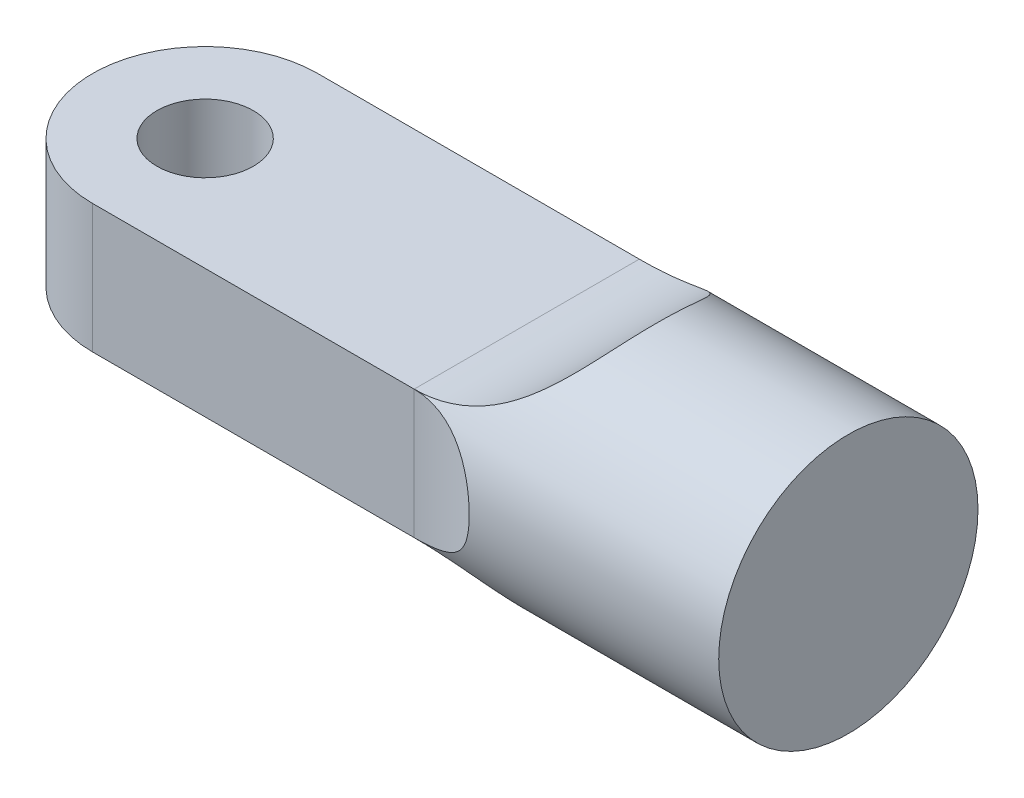
ISO-10303-21;
HEADER;
FILE_DESCRIPTION(('STEP AP214'),'2;1');
FILE_NAME('part.step','',(''),(''),'','','');
FILE_SCHEMA(('AUTOMOTIVE_DESIGN { 1 0 10303 214 1 1 1 1 }'));
ENDSEC;
DATA;
#1=APPLICATION_CONTEXT('core data for automotive mechanical design processes');
#2=APPLICATION_PROTOCOL_DEFINITION('international standard','automotive_design',2000,#1);
#3=PRODUCT_CONTEXT('',#1,'mechanical');
#4=PRODUCT('Part','Part','',(#3));
#5=PRODUCT_RELATED_PRODUCT_CATEGORY('part','',(#4));
#6=PRODUCT_DEFINITION_FORMATION('','',#4);
#7=PRODUCT_DEFINITION_CONTEXT('part definition',#1,'design');
#8=PRODUCT_DEFINITION('design','',#6,#7);
#9=PRODUCT_DEFINITION_SHAPE('','',#8);
#10=(LENGTH_UNIT() NAMED_UNIT(*) SI_UNIT(.MILLI.,.METRE.));
#11=(NAMED_UNIT(*) PLANE_ANGLE_UNIT() SI_UNIT($,.RADIAN.));
#12=(NAMED_UNIT(*) SI_UNIT($,.STERADIAN.) SOLID_ANGLE_UNIT());
#13=UNCERTAINTY_MEASURE_WITH_UNIT(LENGTH_MEASURE(1.E-05),#10,'distance_accuracy_value','');
#14=(GEOMETRIC_REPRESENTATION_CONTEXT(3) GLOBAL_UNCERTAINTY_ASSIGNED_CONTEXT((#13)) GLOBAL_UNIT_ASSIGNED_CONTEXT((#10,
#11,#12)) REPRESENTATION_CONTEXT('',''));
#15=CARTESIAN_POINT('',(0.,0.,0.));
#16=DIRECTION('',(0.,0.,1.));
#17=DIRECTION('',(1.,0.,0.));
#18=AXIS2_PLACEMENT_3D('',#15,#16,#17);
#19=CARTESIAN_POINT('',(0.,20.,-35.));
#20=DIRECTION('',(0.,0.,-1.));
#21=DIRECTION('',(-1.,0.,0.));
#22=AXIS2_PLACEMENT_3D('',#19,#20,#21);
#23=PLANE('',#22);
#24=DIRECTION('',(1.,0.,0.));
#25=VECTOR('',#24,1.);
#26=CARTESIAN_POINT('',(0.,20.,-35.));
#27=LINE('',#26,#25);
#28=CARTESIAN_POINT('',(0.,20.,-35.));
#29=VERTEX_POINT('',#28);
#30=CARTESIAN_POINT('',(99.9999999999998,20.,-34.9999999999997));
#31=VERTEX_POINT('',#30);
#32=EDGE_CURVE('E86',#29,#31,#27,.T.);
#33=ORIENTED_EDGE('',*,*,#32,.T.);
#34=DIRECTION('',(0.,-1.,0.));
#35=VECTOR('',#34,1.);
#36=CARTESIAN_POINT('',(99.9999999999995,20.,-35.));
#37=LINE('',#36,#35);
#38=CARTESIAN_POINT('',(99.9999999999998,-20.,-34.9999999999954));
#39=VERTEX_POINT('',#38);
#40=EDGE_CURVE('E93',#31,#39,#37,.T.);
#41=ORIENTED_EDGE('',*,*,#40,.T.);
#42=DIRECTION('',(1.,0.,0.));
#43=VECTOR('',#42,1.);
#44=CARTESIAN_POINT('',(0.,-20.,-35.));
#45=LINE('',#44,#43);
#46=CARTESIAN_POINT('',(0.,-20.,-35.));
#47=VERTEX_POINT('',#46);
#48=EDGE_CURVE('E89',#47,#39,#45,.T.);
#49=ORIENTED_EDGE('',*,*,#48,.F.);
#50=DIRECTION('',(0.,-1.,0.));
#51=VECTOR('',#50,1.);
#52=CARTESIAN_POINT('',(0.,20.,-35.));
#53=LINE('',#52,#51);
#54=EDGE_CURVE('E82',#29,#47,#53,.T.);
#55=ORIENTED_EDGE('',*,*,#54,.F.);
#56=EDGE_LOOP('',(#33,#41,#49,#55));
#57=FACE_BOUND('',#56,.T.);
#58=ADVANCED_FACE('F41',(#57),#23,.T.);
#59=CARTESIAN_POINT('',(0.,20.,35.));
#60=DIRECTION('',(0.,0.,-1.));
#61=DIRECTION('',(-1.,0.,0.));
#62=AXIS2_PLACEMENT_3D('',#59,#60,#61);
#63=PLANE('',#62);
#64=DIRECTION('',(1.,0.,0.));
#65=VECTOR('',#64,1.);
#66=CARTESIAN_POINT('',(0.,-20.,35.));
#67=LINE('',#66,#65);
#68=CARTESIAN_POINT('',(0.,-20.,35.));
#69=VERTEX_POINT('',#68);
#70=CARTESIAN_POINT('',(100.,-20.,35.0000000000003));
#71=VERTEX_POINT('',#70);
#72=EDGE_CURVE('E112',#69,#71,#67,.T.);
#73=ORIENTED_EDGE('',*,*,#72,.T.);
#74=DIRECTION('',(0.,-1.,0.));
#75=VECTOR('',#74,1.);
#76=CARTESIAN_POINT('',(100.000000000001,20.,35.));
#77=LINE('',#76,#75);
#78=CARTESIAN_POINT('',(100.,20.,34.9999999999942));
#79=VERTEX_POINT('',#78);
#80=EDGE_CURVE('E128',#71,#79,#77,.F.);
#81=ORIENTED_EDGE('',*,*,#80,.T.);
#82=DIRECTION('',(1.,0.,0.));
#83=VECTOR('',#82,1.);
#84=CARTESIAN_POINT('',(0.,20.,35.));
#85=LINE('',#84,#83);
#86=CARTESIAN_POINT('',(0.,20.,35.));
#87=VERTEX_POINT('',#86);
#88=EDGE_CURVE('E103',#87,#79,#85,.T.);
#89=ORIENTED_EDGE('',*,*,#88,.F.);
#90=DIRECTION('',(0.,-1.,0.));
#91=VECTOR('',#90,1.);
#92=CARTESIAN_POINT('',(0.,20.,35.));
#93=LINE('',#92,#91);
#94=EDGE_CURVE('E94',#87,#69,#93,.T.);
#95=ORIENTED_EDGE('',*,*,#94,.T.);
#96=EDGE_LOOP('',(#73,#81,#89,#95));
#97=FACE_BOUND('',#96,.T.);
#98=ADVANCED_FACE('F177',(#97),#63,.F.);
#99=CARTESIAN_POINT('',(0.,20.,0.));
#100=DIRECTION('',(0.,1.,0.));
#101=DIRECTION('',(0.,0.,1.));
#102=AXIS2_PLACEMENT_3D('',#99,#100,#101);
#103=PLANE('',#102);
#104=CARTESIAN_POINT('',(0.,20.,0.));
#105=DIRECTION('',(0.,1.,0.));
#106=DIRECTION('',(0.,0.,1.));
#107=AXIS2_PLACEMENT_3D('',#104,#105,#106);
#108=CIRCLE('',#107,15.);
#109=CARTESIAN_POINT('',(0.,20.,15.));
#110=VERTEX_POINT('',#109);
#111=EDGE_CURVE('E109',#110,#110,#108,.T.);
#112=ORIENTED_EDGE('',*,*,#111,.F.);
#113=EDGE_LOOP('',(#112));
#114=FACE_BOUND('',#113,.T.);
#115=ORIENTED_EDGE('',*,*,#88,.T.);
#116=DIRECTION('',(0.,0.,-1.));
#117=VECTOR('',#116,1.);
#118=CARTESIAN_POINT('',(100.,20.,-6.34413156928661E-13));
#119=LINE('',#118,#117);
#120=EDGE_CURVE('E108',#79,#31,#119,.T.);
#121=ORIENTED_EDGE('',*,*,#120,.T.);
#122=ORIENTED_EDGE('',*,*,#32,.F.);
#123=CARTESIAN_POINT('',(0.,20.,0.));
#124=DIRECTION('',(0.,1.,0.));
#125=DIRECTION('',(0.,0.,1.));
#126=AXIS2_PLACEMENT_3D('',#123,#124,#125);
#127=CIRCLE('',#126,35.);
#128=EDGE_CURVE('E98',#29,#87,#127,.T.);
#129=ORIENTED_EDGE('',*,*,#128,.T.);
#130=EDGE_LOOP('',(#115,#121,#122,#129));
#131=FACE_BOUND('',#130,.T.);
#132=ADVANCED_FACE('F106',(#114,#131),#103,.T.);
#133=CARTESIAN_POINT('',(0.,-20.,0.));
#134=DIRECTION('',(0.,1.,0.));
#135=DIRECTION('',(0.,0.,1.));
#136=AXIS2_PLACEMENT_3D('',#133,#134,#135);
#137=PLANE('',#136);
#138=CARTESIAN_POINT('',(0.,-20.,0.));
#139=DIRECTION('',(0.,1.,0.));
#140=DIRECTION('',(0.,0.,1.));
#141=AXIS2_PLACEMENT_3D('',#138,#139,#140);
#142=CIRCLE('',#141,15.);
#143=CARTESIAN_POINT('',(0.,-20.,15.));
#144=VERTEX_POINT('',#143);
#145=EDGE_CURVE('E117',#144,#144,#142,.T.);
#146=ORIENTED_EDGE('',*,*,#145,.T.);
#147=EDGE_LOOP('',(#146));
#148=FACE_BOUND('',#147,.T.);
#149=ORIENTED_EDGE('',*,*,#48,.T.);
#150=DIRECTION('',(0.,0.,-1.));
#151=VECTOR('',#150,1.);
#152=CARTESIAN_POINT('',(100.,-20.,35.0000000000003));
#153=LINE('',#152,#151);
#154=EDGE_CURVE('E198',#39,#71,#153,.F.);
#155=ORIENTED_EDGE('',*,*,#154,.T.);
#156=ORIENTED_EDGE('',*,*,#72,.F.);
#157=CARTESIAN_POINT('',(0.,-20.,0.));
#158=DIRECTION('',(0.,1.,0.));
#159=DIRECTION('',(0.,0.,1.));
#160=AXIS2_PLACEMENT_3D('',#157,#158,#159);
#161=CIRCLE('',#160,35.);
#162=EDGE_CURVE('E122',#47,#69,#161,.T.);
#163=ORIENTED_EDGE('',*,*,#162,.F.);
#164=EDGE_LOOP('',(#149,#155,#156,#163));
#165=FACE_BOUND('',#164,.T.);
#166=ADVANCED_FACE('F191',(#148,#165),#137,.F.);
#167=CARTESIAN_POINT('',(0.,20.,0.));
#168=DIRECTION('',(0.,-1.,0.));
#169=DIRECTION('',(0.,0.,-1.));
#170=AXIS2_PLACEMENT_3D('',#167,#168,#169);
#171=CYLINDRICAL_SURFACE('',#170,35.);
#172=ORIENTED_EDGE('',*,*,#162,.T.);
#173=ORIENTED_EDGE('',*,*,#94,.F.);
#174=ORIENTED_EDGE('',*,*,#128,.F.);
#175=ORIENTED_EDGE('',*,*,#54,.T.);
#176=EDGE_LOOP('',(#172,#173,#174,#175));
#177=FACE_BOUND('',#176,.T.);
#178=ADVANCED_FACE('F99',(#177),#171,.T.);
#179=CARTESIAN_POINT('',(0.,20.,0.));
#180=DIRECTION('',(0.,-1.,0.));
#181=DIRECTION('',(0.,0.,-1.));
#182=AXIS2_PLACEMENT_3D('',#179,#180,#181);
#183=CYLINDRICAL_SURFACE('',#182,15.);
#184=ORIENTED_EDGE('',*,*,#111,.T.);
#185=EDGE_LOOP('',(#184));
#186=FACE_BOUND('',#185,.T.);
#187=ORIENTED_EDGE('',*,*,#145,.F.);
#188=EDGE_LOOP('',(#187));
#189=FACE_BOUND('',#188,.T.);
#190=ADVANCED_FACE('F153',(#186,#189),#183,.F.);
#191=CARTESIAN_POINT('',(150.,0.,-9.51619735392991E-13));
#192=DIRECTION('',(1.,0.,0.));
#193=DIRECTION('',(0.,0.,-1.));
#194=AXIS2_PLACEMENT_3D('',#191,#192,#193);
#195=CYLINDRICAL_SURFACE('',#194,40.3112887414882);
#196=CARTESIAN_POINT('',(200.,0.,-1.26882631385732E-12));
#197=DIRECTION('',(1.,0.,0.));
#198=DIRECTION('',(0.,0.,-1.));
#199=AXIS2_PLACEMENT_3D('',#196,#197,#198);
#200=CIRCLE('',#199,40.3112887414882);
#201=CARTESIAN_POINT('',(200.,0.,-40.3112887414895));
#202=VERTEX_POINT('',#201);
#203=EDGE_CURVE('E120',#202,#202,#200,.T.);
#204=ORIENTED_EDGE('',*,*,#203,.F.);
#205=EDGE_LOOP('',(#204));
#206=FACE_BOUND('',#205,.T.);
#207=CARTESIAN_POINT('',(99.9999999999998,-20.,-34.9999999999954));
#208=CARTESIAN_POINT('',(100.316458247621,-19.9999956612868,-34.9999975109647));
#209=CARTESIAN_POINT('',(100.63288489274,-19.9947421830849,-35.0030051247058));
#210=CARTESIAN_POINT('',(101.265277746762,-19.9737120426064,-35.0150116053396));
#211=CARTESIAN_POINT('',(101.581243950679,-19.9579352672348,-35.0240105366217));
#212=CARTESIAN_POINT('',(102.527841053449,-19.8947831247184,-35.0599505983783));
#213=CARTESIAN_POINT('',(103.157175248306,-19.8315859418579,-35.095834997604));
#214=CARTESIAN_POINT('',(104.409971580463,-19.662426904606,-35.1908845807871));
#215=CARTESIAN_POINT('',(105.033413392485,-19.5563505827652,-35.2501120693238));
#216=CARTESIAN_POINT('',(106.268833238843,-19.3008686580088,-35.3906446712033));
#217=CARTESIAN_POINT('',(106.880811838077,-19.1514651962277,-35.4719486935583));
#218=CARTESIAN_POINT('',(108.090224785705,-18.8083607402516,-35.6550617520617));
#219=CARTESIAN_POINT('',(108.687633453693,-18.6145870188244,-35.756904420023));
#220=CARTESIAN_POINT('',(109.86256867059,-18.1821792663509,-35.9787073147059));
#221=CARTESIAN_POINT('',(110.440095012201,-17.9435447677392,-36.0986677302588));
#222=CARTESIAN_POINT('',(111.570251375929,-17.4210907988164,-36.3536790321481));
#223=CARTESIAN_POINT('',(112.122903580851,-17.1373126547778,-36.4887160833487));
#224=CARTESIAN_POINT('',(113.199230076074,-16.5241644263273,-36.770446898039));
#225=CARTESIAN_POINT('',(113.722904812897,-16.1947950447158,-36.9171404818255));
#226=CARTESIAN_POINT('',(114.738276269914,-15.4895195376077,-37.2185743297325));
#227=CARTESIAN_POINT('',(115.229859993763,-15.1134612190491,-37.37333990258));
#228=CARTESIAN_POINT('',(116.174421968679,-14.3166051192472,-37.6857781000687));
#229=CARTESIAN_POINT('',(116.62739916474,-13.8958061160755,-37.8434508040102));
#230=CARTESIAN_POINT('',(117.49017183271,-13.0113120083582,-38.1565952107827));
#231=CARTESIAN_POINT('',(117.899970664683,-12.5476202469335,-38.3120670840622));
#232=CARTESIAN_POINT('',(118.672215269828,-11.5801088754669,-38.6155137143806));
#233=CARTESIAN_POINT('',(119.03466791584,-11.0762951067226,-38.7634895576406));
#234=CARTESIAN_POINT('',(119.671733059988,-10.0894100796121,-39.0312172283771));
#235=CARTESIAN_POINT('',(119.951616476186,-9.61009074945936,-39.1522861360015));
#236=CARTESIAN_POINT('',(120.468783752208,-8.62586315410757,-39.3808278047358));
#237=CARTESIAN_POINT('',(120.706068100275,-8.12095518227369,-39.4883007216698));
#238=CARTESIAN_POINT('',(121.135952269211,-7.09008625849753,-39.6863430645485));
#239=CARTESIAN_POINT('',(121.328610556354,-6.56415392347483,-39.7769345766633));
#240=CARTESIAN_POINT('',(121.668240664662,-5.49492001083491,-39.9386770435708));
#241=CARTESIAN_POINT('',(121.815225333977,-4.95162336537334,-40.0098334648408));
#242=CARTESIAN_POINT('',(122.0197688824,-4.04250701444694,-40.1097143293616));
#243=CARTESIAN_POINT('',(122.09067418746,-3.68029702069758,-40.1446025167955));
#244=CARTESIAN_POINT('',(122.212360585053,-2.95173169753072,-40.2047359689521));
#245=CARTESIAN_POINT('',(122.263143794574,-2.58537680835955,-40.229982248063));
#246=CARTESIAN_POINT('',(122.344450983402,-1.84985573874784,-40.270506646434));
#247=CARTESIAN_POINT('',(122.374973692046,-1.48068938345112,-40.2857841404886));
#248=CARTESIAN_POINT('',(122.415676358058,-0.741028359304655,-40.3061755717437));
#249=CARTESIAN_POINT('',(122.425859189078,-0.370533885504404,-40.3112909446655));
#250=CARTESIAN_POINT('',(122.425855224418,0.5160844243466,-40.311285672876));
#251=CARTESIAN_POINT('',(122.40609574194,1.03224530456673,-40.3013548743775));
#252=CARTESIAN_POINT('',(122.327144584878,2.06084647471009,-40.2618674004094));
#253=CARTESIAN_POINT('',(122.267945106583,2.57328600802829,-40.2323068409424));
#254=CARTESIAN_POINT('',(122.110352844016,3.59106435646676,-40.1542640816854));
#255=CARTESIAN_POINT('',(122.011929262887,4.09639726828023,-40.1057670144772));
#256=CARTESIAN_POINT('',(121.776422881152,5.09588417800759,-39.9910616481421));
#257=CARTESIAN_POINT('',(121.639342040463,5.59003874129015,-39.9248542469348));
#258=CARTESIAN_POINT('',(121.327511362983,6.56305700736616,-39.7764773865862));
#259=CARTESIAN_POINT('',(121.152815023897,7.04194132869968,-39.6943306130533));
#260=CARTESIAN_POINT('',(120.76666906226,7.98194734052419,-39.5160397260343));
#261=CARTESIAN_POINT('',(120.555219183097,8.4430689069682,-39.419895514819));
#262=CARTESIAN_POINT('',(120.096918750052,9.34455205419734,-39.2159776000449));
#263=CARTESIAN_POINT('',(119.850075121208,9.78491767368681,-39.1082061724517));
#264=CARTESIAN_POINT('',(119.322540392378,10.6424381663972,-38.8836083556435));
#265=CARTESIAN_POINT('',(119.041848852222,11.0595927376706,-38.7667818486801));
#266=CARTESIAN_POINT('',(118.442241907253,11.8770223380716,-38.5243028139307));
#267=CARTESIAN_POINT('',(118.122648439142,12.2767600407141,-38.3985165867274));
#268=CARTESIAN_POINT('',(117.452309201988,13.0479789265637,-38.1433516703419));
#269=CARTESIAN_POINT('',(117.101561396901,13.4194582600374,-38.0139727467448));
#270=CARTESIAN_POINT('',(116.371330768344,14.1327881988022,-37.7545808561559));
#271=CARTESIAN_POINT('',(115.991846070796,14.4746368686044,-37.6245678483304));
#272=CARTESIAN_POINT('',(115.206730061969,15.1277547036355,-37.3667544043722));
#273=CARTESIAN_POINT('',(114.801097756793,15.4390227053251,-37.2389540525792));
#274=CARTESIAN_POINT('',(113.93518572351,16.0525093336998,-36.9788604556612));
#275=CARTESIAN_POINT('',(113.473086740828,16.352320294973,-36.8469433556754));
#276=CARTESIAN_POINT('',(112.525086455444,16.9157605153125,-36.5917031406542));
#277=CARTESIAN_POINT('',(112.039183933523,17.1793879184189,-36.4683804666116));
#278=CARTESIAN_POINT('',(111.046466091846,17.6707590022697,-36.2328386414287));
#279=CARTESIAN_POINT('',(110.539633553495,17.8984723642544,-36.1206289012806));
#280=CARTESIAN_POINT('',(109.508670812617,18.3180758222289,-35.9096538793416));
#281=CARTESIAN_POINT('',(108.984540421215,18.5099655269103,-35.8108887444117));
#282=CARTESIAN_POINT('',(107.865298933948,18.8770040052313,-35.6189017283564));
#283=CARTESIAN_POINT('',(107.268586056307,19.0481752615731,-35.527398795893));
#284=CARTESIAN_POINT('',(106.061696051758,19.3478983286988,-35.3650657743851));
#285=CARTESIAN_POINT('',(105.451516179606,19.4764413625208,-35.2942399430226));
#286=CARTESIAN_POINT('',(104.222605405949,19.6913254625972,-35.1748032035339));
#287=CARTESIAN_POINT('',(103.603888509941,19.777728760443,-35.1261595439186));
#288=CARTESIAN_POINT('',(102.360942990101,19.9090530935152,-35.051895045997));
#289=CARTESIAN_POINT('',(101.736717416344,19.953995788255,-35.0262621867627));
#290=CARTESIAN_POINT('',(100.926363806419,19.9855768641661,-35.0082379745757));
#291=CARTESIAN_POINT('',(100.741042918435,19.9909888336683,-35.0051476997151));
#292=CARTESIAN_POINT('',(100.370486450485,19.9981982910022,-35.0010299782894));
#293=CARTESIAN_POINT('',(100.185250960189,19.9999992540279,-35.0000005483906));
#294=CARTESIAN_POINT('',(99.9999999999994,19.999999999992,-35.));
#295=B_SPLINE_CURVE_WITH_KNOTS('',3,(#207,#208,#209,#210,#211,#212,#213,#214,#215,#216,#217,
#218,#219,#220,#221,#222,#223,#224,#225,#226,#227,#228,#229,#230,#231,#232,#233,#234,#235,#236,
#237,#238,#239,#240,#241,#242,#243,#244,#245,#246,#247,#248,#249,#250,#251,#252,#253,#254,#255,
#256,#257,#258,#259,#260,#261,#262,#263,#264,#265,#266,#267,#268,#269,#270,#271,#272,#273,#274,
#275,#276,#277,#278,#279,#280,#281,#282,#283,#284,#285,#286,#287,#288,#289,#290,#291,#292,#293,
#294),.UNSPECIFIED.,.F.,.F.,(4,2,2,2,2,2,2,2,2,2,2,2,2,2,2,2,2,2,2,2,2,2,2,2,2,2,2,2,2,2,2,2,2,
2,2,2,2,2,2,2,2,2,2,4),(0.,0.949253421667837,1.8985170452338,3.79702991565234,5.70064476402707,
7.60416555585341,9.51082902792988,11.4175123734757,13.3224602052182,15.2273786749814,
17.1386782485358,19.0500300356657,20.9612329747121,22.8721581717419,24.5742132924346,
26.27624890405,27.9760418407332,29.6753561858453,30.7869181788133,31.8983631963795,
33.0098779129909,34.1212355817939,35.6691490255746,37.2173688349726,38.7668066337019,
40.3161658903212,41.863335995102,43.4105169026561,44.9573955053983,46.5042942264434,
48.0836279287023,49.6630649220166,51.2426050072661,52.8222051679127,54.5196527746206,
56.2171874158467,57.9161475383806,59.6151262178782,61.4955807125175,63.3764221443561,
65.254477491521,67.1315511636666,67.6877970523348,68.2435073584866),.UNSPECIFIED.);
#296=EDGE_CURVE('E131',#39,#31,#295,.T.);
#297=ORIENTED_EDGE('',*,*,#296,.T.);
#298=CARTESIAN_POINT('',(99.9999999999998,20.,-34.9999999999997));
#299=CARTESIAN_POINT('',(100.583562965653,19.999989488465,-34.9999804255429));
#300=CARTESIAN_POINT('',(101.167127534786,20.010215991688,-34.9941613699238));
#301=CARTESIAN_POINT('',(102.333315350948,20.0510682891513,-34.9707834366231));
#302=CARTESIAN_POINT('',(102.915938583478,20.0816943946677,-34.9532243798015));
#303=CARTESIAN_POINT('',(104.079442427857,20.1632824506073,-34.9062190680328));
#304=CARTESIAN_POINT('',(104.660322512384,20.2142500308439,-34.876769522185));
#305=CARTESIAN_POINT('',(105.819209584757,20.3363688397335,-34.8057053851524));
#306=CARTESIAN_POINT('',(106.397216581255,20.407520007577,-34.7640908306186));
#307=CARTESIAN_POINT('',(107.552330753101,20.570209072888,-34.6680754870022));
#308=CARTESIAN_POINT('',(108.12941813839,20.6618495741848,-34.6136102673663));
#309=CARTESIAN_POINT('',(109.278733194216,20.8650258324378,-34.4915170312806));
#310=CARTESIAN_POINT('',(109.850960433481,20.9765633360543,-34.4238878591845));
#311=CARTESIAN_POINT('',(110.989374914459,21.2191401190636,-34.2748938616928));
#312=CARTESIAN_POINT('',(111.555563051249,21.3501764641843,-34.1935311027412));
#313=CARTESIAN_POINT('',(112.680960715343,21.6313154267295,-34.0163754712348));
#314=CARTESIAN_POINT('',(113.240169656045,21.7814196351185,-33.9205813944507));
#315=CARTESIAN_POINT('',(114.352047252932,22.1005822128969,-33.713507008523));
#316=CARTESIAN_POINT('',(114.904692558361,22.2696936960647,-33.6021830827882));
#317=CARTESIAN_POINT('',(116.000645918646,22.625837147003,-33.3634148785518));
#318=CARTESIAN_POINT('',(116.543954102541,22.8128688668813,-33.2359708230336));
#319=CARTESIAN_POINT('',(117.620119395645,23.2040683929997,-32.9640403948497));
#320=CARTESIAN_POINT('',(118.152975261073,23.4082382235214,-32.8195520081599));
#321=CARTESIAN_POINT('',(119.206890388118,23.8327167259781,-32.5126159909385));
#322=CARTESIAN_POINT('',(119.727951002849,24.0530235343203,-32.3501704331064));
#323=CARTESIAN_POINT('',(120.755926593937,24.5081682036104,-32.0067301871029));
#324=CARTESIAN_POINT('',(121.262870951837,24.7429720019567,-31.8257783703645));
#325=CARTESIAN_POINT('',(122.262520862281,25.2262539958448,-31.4440916562618));
#326=CARTESIAN_POINT('',(122.755228197667,25.4747304677975,-31.2433592499443));
#327=CARTESIAN_POINT('',(123.725187073619,25.9839176325988,-30.8211840552255));
#328=CARTESIAN_POINT('',(124.202439274598,26.2446278015198,-30.5997421533389));
#329=CARTESIAN_POINT('',(125.140252441981,26.7766462123858,-30.1352930565311));
#330=CARTESIAN_POINT('',(125.600813847277,27.0479541752664,-29.8922864292449));
#331=CARTESIAN_POINT('',(126.465338947432,27.5757154963185,-29.4057383718405));
#332=CARTESIAN_POINT('',(126.870771362003,27.8314505290523,-29.1640258628921));
#333=CARTESIAN_POINT('',(127.665820673781,28.3487419722297,-28.6614526956033));
#334=CARTESIAN_POINT('',(128.0554362497,28.6102988661994,-28.4005904426435));
#335=CARTESIAN_POINT('',(128.817955753594,29.1375444321185,-27.859400621896));
#336=CARTESIAN_POINT('',(129.190860748846,29.4032328387313,-27.5790743001683));
#337=CARTESIAN_POINT('',(129.919224608088,29.937001422097,-26.9987288607681));
#338=CARTESIAN_POINT('',(130.274683752883,30.205081560271,-26.6987100602433));
#339=CARTESIAN_POINT('',(130.967274352989,30.7416290240963,-26.0791116931697));
#340=CARTESIAN_POINT('',(131.304417530888,31.0100959864671,-25.7595449229559));
#341=CARTESIAN_POINT('',(131.960026401549,31.5456651450343,-25.100820286721));
#342=CARTESIAN_POINT('',(132.278494473186,31.8127675110817,-24.7616649269084));
#343=CARTESIAN_POINT('',(132.896354328258,32.3437154046603,-24.0640014780383));
#344=CARTESIAN_POINT('',(133.195747088005,32.6075610983161,-23.7054943811778));
#345=CARTESIAN_POINT('',(133.775136162537,33.130060831499,-22.9696067221053));
#346=CARTESIAN_POINT('',(134.055133248719,33.3887150772071,-22.59222691152));
#347=CARTESIAN_POINT('',(134.78803729965,34.0806866732838,-21.5437895210596));
#348=CARTESIAN_POINT('',(135.222130488733,34.5072557164198,-20.8549252004039));
#349=CARTESIAN_POINT('',(136.032812603737,35.3305530062137,-19.4275830727799));
#350=CARTESIAN_POINT('',(136.409407165693,35.7272841756534,-18.6891101386962));
#351=CARTESIAN_POINT('',(137.106358986639,36.4830991616822,-17.1669986633535));
#352=CARTESIAN_POINT('',(137.426680474802,36.8421589739234,-16.3833318112271));
#353=CARTESIAN_POINT('',(138.01237479941,37.5152562240655,-14.7771368161151));
#354=CARTESIAN_POINT('',(138.277749027459,37.8292948021215,-13.9546096579617));
#355=CARTESIAN_POINT('',(138.745392299797,38.394252243434,-12.3127138352209));
#356=CARTESIAN_POINT('',(138.949864856458,38.6472872477415,-11.4946980642518));
#357=CARTESIAN_POINT('',(139.312128005664,39.1027290312492,-9.83450652977361));
#358=CARTESIAN_POINT('',(139.469914378485,39.3051312337554,-8.99232858991229));
#359=CARTESIAN_POINT('',(139.740178692922,39.6558553747178,-7.29148534231722));
#360=CARTESIAN_POINT('',(139.852746710557,39.8042847717631,-6.43285641816754));
#361=CARTESIAN_POINT('',(140.034330338206,40.0454457315758,-4.70359449498201));
#362=CARTESIAN_POINT('',(140.103366495198,40.1382035702421,-3.83296735767665));
#363=CARTESIAN_POINT('',(140.177962190565,40.2387312175791,-2.46739206303615));
#364=CARTESIAN_POINT('',(140.198077358282,40.2659270645266,-1.97454884989476));
#365=CARTESIAN_POINT('',(140.224888296057,40.3022077841873,-0.987823003592299));
#366=CARTESIAN_POINT('',(140.231583784491,40.3112922768199,-0.493940348835491));
#367=CARTESIAN_POINT('',(140.231586933164,40.3112823247934,0.8965111972845));
#368=CARTESIAN_POINT('',(140.209535736986,40.2813372670782,1.79321245585703));
#369=CARTESIAN_POINT('',(140.121007218607,40.1619345793911,3.58080048856377));
#370=CARTESIAN_POINT('',(140.054507322001,40.0724467091874,4.4716840757727));
#371=CARTESIAN_POINT('',(139.875982517837,39.8349847475683,6.24290413927903));
#372=CARTESIAN_POINT('',(139.76386564977,39.6868925306475,7.12321559040453));
#373=CARTESIAN_POINT('',(139.492716066949,39.3344697787806,8.86503943552261));
#374=CARTESIAN_POINT('',(139.33368964571,39.1301467881588,9.72655433467216));
#375=CARTESIAN_POINT('',(138.966874678052,38.6683932085286,11.4249745565739));
#376=CARTESIAN_POINT('',(138.759068779433,38.4109437249189,12.2618710023733));
#377=CARTESIAN_POINT('',(138.292768652767,37.8472776022463,13.9045899737317));
#378=CARTESIAN_POINT('',(138.034273014278,37.541059606246,14.7104116338892));
#379=CARTESIAN_POINT('',(137.464960831682,36.8855792702555,16.2843528609666));
#380=CARTESIAN_POINT('',(137.154188685289,36.5363535230152,17.05250371214));
#381=CARTESIAN_POINT('',(136.478652215318,35.8012142046632,18.5463206398958));
#382=CARTESIAN_POINT('',(136.113889456582,35.4153016969818,19.271987946954));
#383=CARTESIAN_POINT('',(135.335965864264,34.6210058161857,20.664409060408));
#384=CARTESIAN_POINT('',(134.923706467956,34.2131003528631,21.331939434501));
#385=CARTESIAN_POINT('',(134.046037825179,33.3771325419319,22.6175818057533));
#386=CARTESIAN_POINT('',(133.580629340839,32.9490704834095,23.235694511319));
#387=CARTESIAN_POINT('',(132.597508954257,32.0812422304242,24.4199287491983));
#388=CARTESIAN_POINT('',(132.079795240993,31.6414756310906,24.986048480005));
#389=CARTESIAN_POINT('',(130.993892189454,30.7588468310994,26.0649040739936));
#390=CARTESIAN_POINT('',(130.425702234877,30.3159845927057,26.5776392851982));
#391=CARTESIAN_POINT('',(129.239317578376,29.4338726173607,27.551415486796));
#392=CARTESIAN_POINT('',(128.620942897946,28.9946427234368,28.0122548659717));
#393=CARTESIAN_POINT('',(127.339502976629,28.1293746426903,28.8810368301346));
#394=CARTESIAN_POINT('',(126.676437691784,27.7033364688438,29.2889793630901));
#395=CARTESIAN_POINT('',(125.309397226151,26.8714156947001,30.0540608890183));
#396=CARTESIAN_POINT('',(124.605412067099,26.4655380556533,30.4111874167429));
#397=CARTESIAN_POINT('',(123.160911113029,25.6801600014896,31.0772356738151));
#398=CARTESIAN_POINT('',(122.420393591771,25.3006608348622,31.3861551223887));
#399=CARTESIAN_POINT('',(120.834972245056,24.5384845548677,31.9862486986499));
#400=CARTESIAN_POINT('',(119.986849048893,24.1589572366461,32.2729194069482));
#401=CARTESIAN_POINT('',(118.25763236577,23.4432092315925,32.7965338532294));
#402=CARTESIAN_POINT('',(117.376536329937,23.1069919016804,33.0334737375136));
#403=CARTESIAN_POINT('',(115.586151978644,22.4818796216263,33.4620508741364));
#404=CARTESIAN_POINT('',(114.676840736054,22.1930244217008,33.6536501320403));
#405=CARTESIAN_POINT('',(112.835995843847,21.6662255119145,33.995194612404));
#406=CARTESIAN_POINT('',(111.904463139832,21.4282796399596,34.1451416038957));
#407=CARTESIAN_POINT('',(110.070055236356,21.0159787140281,34.4003548936544));
#408=CARTESIAN_POINT('',(109.167999589022,20.8390873094859,34.5074443506314));
#409=CARTESIAN_POINT('',(107.352271383279,20.5349493390393,34.6892975625872));
#410=CARTESIAN_POINT('',(106.438598839771,20.407702709464,34.7640613590245));
#411=CARTESIAN_POINT('',(105.063636609487,20.2549320522093,34.8531348128732));
#412=CARTESIAN_POINT('',(104.605096448562,20.2103874075746,34.8789643129878));
#413=CARTESIAN_POINT('',(103.686583132197,20.1339652374965,34.9231360110609));
#414=CARTESIAN_POINT('',(103.226609975653,20.1020877217981,34.9414782032595));
#415=CARTESIAN_POINT('',(102.30576429264,20.0510653827676,34.9707832088641));
#416=CARTESIAN_POINT('',(101.844891838505,20.0319195745277,34.9817465930856));
#417=CARTESIAN_POINT('',(100.922680204128,20.0063850367495,34.9963511508152));
#418=CARTESIAN_POINT('',(100.461341026477,19.9999962367822,34.9999923647474));
#419=CARTESIAN_POINT('',(99.9999999999994,20.,34.9999999999942));
#420=B_SPLINE_CURVE_WITH_KNOTS('',3,(#298,#299,#300,#301,#302,#303,#304,#305,#306,#307,#308,
#309,#310,#311,#312,#313,#314,#315,#316,#317,#318,#319,#320,#321,#322,#323,#324,#325,#326,#327,
#328,#329,#330,#331,#332,#333,#334,#335,#336,#337,#338,#339,#340,#341,#342,#343,#344,#345,#346,
#347,#348,#349,#350,#351,#352,#353,#354,#355,#356,#357,#358,#359,#360,#361,#362,#363,#364,#365,
#366,#367,#368,#369,#370,#371,#372,#373,#374,#375,#376,#377,#378,#379,#380,#381,#382,#383,#384,
#385,#386,#387,#388,#389,#390,#391,#392,#393,#394,#395,#396,#397,#398,#399,#400,#401,#402,#403,
#404,#405,#406,#407,#408,#409,#410,#411,#412,#413,#414,#415,#416,#417,#418,#419),.UNSPECIFIED.,
.F.,.F.,(4,2,2,2,2,2,2,2,2,2,2,2,2,2,2,2,2,2,2,2,2,2,2,2,2,2,2,2,2,2,2,2,2,2,2,2,2,2,2,2,2,2,2,
2,2,2,2,2,2,2,2,2,2,2,2,2,2,2,2,2,4),(0.,1.75057295511762,3.50117262272331,5.25225713185143,
7.00333636533284,8.76338904876506,10.5235963146928,12.2835389641964,14.0436285545274,
15.808764906235,17.5738768441733,19.3391975638816,21.1043147344619,22.8654316932288,
24.6263271504235,26.3871472631617,28.1479210406605,29.757866273285,31.3679457201599,
32.9779221870804,34.5878727316666,36.1967804334514,37.8054827419765,39.414102647767,
41.0226585394318,43.776383448353,46.5298382626757,49.2850370682073,52.0401660864716,
54.6781427098622,57.3163576936077,59.9492909150258,62.5809804636309,64.0625269758315,
65.5441045790859,68.2331963167764,70.9236548171032,73.6195641743226,76.3151120051791,
79.0116201733516,81.7082033824097,84.4025078776313,87.0967342974936,89.7463472256531,
92.3959221645825,95.0455888741516,97.695287939918,100.354949497438,103.014613671099,
105.67492914407,108.335370443793,111.249582818141,114.164020934847,117.08089270538,
119.997640573203,122.772067585089,125.546491038681,126.930565305875,128.314640637847,
129.69860888715,131.082569495813),.UNSPECIFIED.);
#421=EDGE_CURVE('E11',#31,#79,#420,.T.);
#422=ORIENTED_EDGE('',*,*,#421,.T.);
#423=CARTESIAN_POINT('',(100.,20.,34.9999999999942));
#424=CARTESIAN_POINT('',(100.316458247622,19.9999956612854,34.9999975109643));
#425=CARTESIAN_POINT('',(100.632884892741,19.9947421830829,35.0030051247057));
#426=CARTESIAN_POINT('',(101.265277746762,19.973712042604,35.0150116053397));
#427=CARTESIAN_POINT('',(101.581243950679,19.9579352672325,35.0240105366218));
#428=CARTESIAN_POINT('',(102.527841053448,19.8947831247164,35.0599505983782));
#429=CARTESIAN_POINT('',(103.157175248306,19.8315859418558,35.0958349976039));
#430=CARTESIAN_POINT('',(104.409971580462,19.6624269046038,35.190884580787));
#431=CARTESIAN_POINT('',(105.033413392484,19.5563505827631,35.2501120693237));
#432=CARTESIAN_POINT('',(106.268833238843,19.3008686580067,35.3906446712031));
#433=CARTESIAN_POINT('',(106.880811838076,19.1514651962256,35.4719486935581));
#434=CARTESIAN_POINT('',(108.090224785704,18.8083607402495,35.6550617520615));
#435=CARTESIAN_POINT('',(108.687633453692,18.6145870188223,35.7569044200227));
#436=CARTESIAN_POINT('',(109.86256867059,18.1821792663488,35.9787073147055));
#437=CARTESIAN_POINT('',(110.4400950122,17.9435447677372,36.0986677302584));
#438=CARTESIAN_POINT('',(111.570251375928,17.4210907988144,36.3536790321476));
#439=CARTESIAN_POINT('',(112.12290358085,17.1373126547759,36.4887160833482));
#440=CARTESIAN_POINT('',(113.199230076073,16.5241644263255,36.7704468980384));
#441=CARTESIAN_POINT('',(113.722904812896,16.1947950447141,36.9171404818248));
#442=CARTESIAN_POINT('',(114.738276269913,15.4895195376061,37.2185743297318));
#443=CARTESIAN_POINT('',(115.229859993762,15.1134612190475,37.3733399025792));
#444=CARTESIAN_POINT('',(116.174421968677,14.3166051192456,37.6857781000678));
#445=CARTESIAN_POINT('',(116.627399164739,13.895806116074,37.8434508040092));
#446=CARTESIAN_POINT('',(117.490171832708,13.0113120083568,38.1565952107817));
#447=CARTESIAN_POINT('',(117.899970664681,12.5476202469322,38.3120670840611));
#448=CARTESIAN_POINT('',(118.672215269826,11.5801088754656,38.6155137143795));
#449=CARTESIAN_POINT('',(119.034667915838,11.0762951067214,38.7634895576394));
#450=CARTESIAN_POINT('',(119.671733059987,10.089410079611,39.0312172283759));
#451=CARTESIAN_POINT('',(119.951616476184,9.61009074945826,39.1522861360002));
#452=CARTESIAN_POINT('',(120.468783752206,8.62586315410657,39.3808278047344));
#453=CARTESIAN_POINT('',(120.706068100273,8.12095518227274,39.4883007216685));
#454=CARTESIAN_POINT('',(121.135952269209,7.09008625849668,39.6863430645471));
#455=CARTESIAN_POINT('',(121.328610556352,6.56415392347403,39.7769345766619));
#456=CARTESIAN_POINT('',(121.66824066466,5.49492001083422,39.9386770435693));
#457=CARTESIAN_POINT('',(121.815225333975,4.95162336537271,40.0098334648393));
#458=CARTESIAN_POINT('',(122.019768882398,4.04250701444637,40.1097143293601));
#459=CARTESIAN_POINT('',(122.090674187459,3.68029702069702,40.144602516794));
#460=CARTESIAN_POINT('',(122.212360585051,2.95173169753018,40.2047359689506));
#461=CARTESIAN_POINT('',(122.263143794572,2.58537680835903,40.2299822480614));
#462=CARTESIAN_POINT('',(122.3444509834,1.84985573874734,40.2705066464324));
#463=CARTESIAN_POINT('',(122.374973692044,1.48068938345062,40.285784140487));
#464=CARTESIAN_POINT('',(122.415676358056,0.741028359304182,40.3061755717421));
#465=CARTESIAN_POINT('',(122.425859189076,0.370533885503942,40.311290944664));
#466=CARTESIAN_POINT('',(122.425855224416,-0.516084424346997,40.3112856728745));
#467=CARTESIAN_POINT('',(122.406095741938,-1.03224530456708,40.3013548743759));
#468=CARTESIAN_POINT('',(122.327144584876,-2.06084647471032,40.2618674004078));
#469=CARTESIAN_POINT('',(122.267945106581,-2.57328600802847,40.2323068409409));
#470=CARTESIAN_POINT('',(122.110352844014,-3.59106435646683,40.1542640816839));
#471=CARTESIAN_POINT('',(122.011929262885,-4.09639726828025,40.1057670144757));
#472=CARTESIAN_POINT('',(121.77642288115,-5.0958841780075,39.9910616481406));
#473=CARTESIAN_POINT('',(121.639342040461,-5.59003874129,39.9248542469333));
#474=CARTESIAN_POINT('',(121.327511362981,-6.56305700736591,39.7764773865848));
#475=CARTESIAN_POINT('',(121.152815023895,-7.04194132869938,39.6943306130518));
#476=CARTESIAN_POINT('',(120.766669062258,-7.98194734052378,39.5160397260329));
#477=CARTESIAN_POINT('',(120.555219183095,-8.44306890696772,39.4198955148176));
#478=CARTESIAN_POINT('',(120.09691875005,-9.34455205419676,39.2159776000435));
#479=CARTESIAN_POINT('',(119.850075121206,-9.7849176736862,39.1082061724504));
#480=CARTESIAN_POINT('',(119.322540392376,-10.6424381663965,38.8836083556421));
#481=CARTESIAN_POINT('',(119.04184885222,-11.0595927376699,38.7667818486788));
#482=CARTESIAN_POINT('',(118.442241907251,-11.8770223380707,38.5243028139295));
#483=CARTESIAN_POINT('',(118.12264843914,-12.2767600407132,38.3985165867262));
#484=CARTESIAN_POINT('',(117.452309201986,-13.0479789265626,38.1433516703408));
#485=CARTESIAN_POINT('',(117.101561396899,-13.4194582600363,38.0139727467437));
#486=CARTESIAN_POINT('',(116.371330768342,-14.132788198801,37.7545808561549));
#487=CARTESIAN_POINT('',(115.991846070794,-14.4746368686032,37.6245678483294));
#488=CARTESIAN_POINT('',(115.206730061967,-15.1277547036342,37.3667544043712));
#489=CARTESIAN_POINT('',(114.801097756791,-15.4390227053238,37.2389540525783));
#490=CARTESIAN_POINT('',(113.935185723509,-16.0525093336984,36.9788604556604));
#491=CARTESIAN_POINT('',(113.473086740826,-16.3523202949715,36.8469433556746));
#492=CARTESIAN_POINT('',(112.525086455442,-16.915760515311,36.5917031406535));
#493=CARTESIAN_POINT('',(112.039183933521,-17.1793879184173,36.4683804666109));
#494=CARTESIAN_POINT('',(111.046466091845,-17.670759002268,36.2328386414281));
#495=CARTESIAN_POINT('',(110.539633553494,-17.8984723642527,36.12062890128));
#496=CARTESIAN_POINT('',(109.508670812615,-18.3180758222272,35.9096538793411));
#497=CARTESIAN_POINT('',(108.984540421214,-18.5099655269085,35.8108887444112));
#498=CARTESIAN_POINT('',(107.865298933946,-18.8770040052294,35.618901728356));
#499=CARTESIAN_POINT('',(107.268586056305,-19.0481752615712,35.5273987958927));
#500=CARTESIAN_POINT('',(106.061696051757,-19.3478983286969,35.3650657743848));
#501=CARTESIAN_POINT('',(105.451516179605,-19.4764413625189,35.2942399430223));
#502=CARTESIAN_POINT('',(104.222605405948,-19.6913254625952,35.1748032035337));
#503=CARTESIAN_POINT('',(103.603888509939,-19.7777287604409,35.1261595439184));
#504=CARTESIAN_POINT('',(102.3609429901,-19.9090530935131,35.0518950459969));
#505=CARTESIAN_POINT('',(101.736717416343,-19.9539957882529,35.0262621867626));
#506=CARTESIAN_POINT('',(100.926363806419,-19.985576864164,35.0082379745757));
#507=CARTESIAN_POINT('',(100.741042918434,-19.9909888336661,35.0051476997151));
#508=CARTESIAN_POINT('',(100.370486450485,-19.998198291,35.0010299782893));
#509=CARTESIAN_POINT('',(100.185250960189,-19.9999992540257,35.0000005483906));
#510=CARTESIAN_POINT('',(99.9999999999997,-19.9999999999898,35.));
#511=B_SPLINE_CURVE_WITH_KNOTS('',3,(#423,#424,#425,#426,#427,#428,#429,#430,#431,#432,#433,
#434,#435,#436,#437,#438,#439,#440,#441,#442,#443,#444,#445,#446,#447,#448,#449,#450,#451,#452,
#453,#454,#455,#456,#457,#458,#459,#460,#461,#462,#463,#464,#465,#466,#467,#468,#469,#470,#471,
#472,#473,#474,#475,#476,#477,#478,#479,#480,#481,#482,#483,#484,#485,#486,#487,#488,#489,#490,
#491,#492,#493,#494,#495,#496,#497,#498,#499,#500,#501,#502,#503,#504,#505,#506,#507,#508,#509,
#510),.UNSPECIFIED.,.F.,.F.,(4,2,2,2,2,2,2,2,2,2,2,2,2,2,2,2,2,2,2,2,2,2,2,2,2,2,2,2,2,2,2,2,2,
2,2,2,2,2,2,2,2,2,2,4),(0.,0.949253421667622,1.89851704523339,3.79702991565169,5.70064476402629,
7.60416555585249,9.51082902792873,11.4175123734743,13.3224602052165,15.2273786749794,
17.1386782485337,19.0500300356634,20.9612329747096,22.8721581717393,24.5742132924318,
26.276248904047,27.97604184073,29.6753561858419,30.7869181788099,31.898363196376,
33.0098779129875,34.1212355817904,35.6691490255709,37.2173688349688,38.7668066336979,
40.316165890317,41.8633359950977,43.4105169026517,44.9573955053937,46.5042942264386,
48.0836279286973,49.6630649220115,51.2426050072608,52.8222051679072,54.519652774615,
56.217187415841,57.9161475383747,59.6151262178722,61.4955807125113,63.3764221443498,
65.2544774915144,67.1315511636598,67.6877970523275,68.2435073584787),.UNSPECIFIED.);
#512=EDGE_CURVE('E138',#79,#71,#511,.T.);
#513=ORIENTED_EDGE('',*,*,#512,.T.);
#514=CARTESIAN_POINT('',(100.,-20.,35.0000000000003));
#515=CARTESIAN_POINT('',(100.583562965653,-19.999989488465,34.9999804255423));
#516=CARTESIAN_POINT('',(101.167127534786,-20.010215991688,34.9941613699227));
#517=CARTESIAN_POINT('',(102.333315350949,-20.0510682891513,34.9707834366216));
#518=CARTESIAN_POINT('',(102.915938583478,-20.0816943946677,34.9532243798002));
#519=CARTESIAN_POINT('',(104.079442427857,-20.1632824506073,34.9062190680315));
#520=CARTESIAN_POINT('',(104.660322512384,-20.2142500308439,34.8767695221837));
#521=CARTESIAN_POINT('',(105.819209584758,-20.3363688397335,34.805705385151));
#522=CARTESIAN_POINT('',(106.397216581256,-20.407520007577,34.7640908306172));
#523=CARTESIAN_POINT('',(107.552330753101,-20.570209072888,34.6680754870009));
#524=CARTESIAN_POINT('',(108.12941813839,-20.6618495741848,34.6136102673649));
#525=CARTESIAN_POINT('',(109.278733194216,-20.8650258324378,34.4915170312792));
#526=CARTESIAN_POINT('',(109.850960433482,-20.9765633360543,34.4238878591831));
#527=CARTESIAN_POINT('',(110.98937491446,-21.2191401190636,34.2748938616914));
#528=CARTESIAN_POINT('',(111.555563051249,-21.3501764641843,34.1935311027397));
#529=CARTESIAN_POINT('',(112.680960715344,-21.6313154267296,34.0163754712334));
#530=CARTESIAN_POINT('',(113.240169656045,-21.7814196351186,33.9205813944492));
#531=CARTESIAN_POINT('',(114.352047252932,-22.1005822128969,33.7135070085215));
#532=CARTESIAN_POINT('',(114.904692558361,-22.2696936960647,33.6021830827867));
#533=CARTESIAN_POINT('',(116.000645918647,-22.6258371470031,33.3634148785503));
#534=CARTESIAN_POINT('',(116.543954102542,-22.8128688668814,33.235970823032));
#535=CARTESIAN_POINT('',(117.620119395645,-23.2040683929998,32.9640403948481));
#536=CARTESIAN_POINT('',(118.152975261074,-23.4082382235215,32.8195520081583));
#537=CARTESIAN_POINT('',(119.206890388119,-23.8327167259782,32.5126159909369));
#538=CARTESIAN_POINT('',(119.72795100285,-24.0530235343204,32.3501704331048));
#539=CARTESIAN_POINT('',(120.755926593938,-24.5081682036105,32.0067301871012));
#540=CARTESIAN_POINT('',(121.262870951838,-24.7429720019569,31.8257783703628));
#541=CARTESIAN_POINT('',(122.262520862282,-25.226253995845,31.4440916562602));
#542=CARTESIAN_POINT('',(122.755228197668,-25.4747304677976,31.2433592499426));
#543=CARTESIAN_POINT('',(123.725187073619,-25.983917632599,30.8211840552238));
#544=CARTESIAN_POINT('',(124.202439274598,-26.24462780152,30.5997421533372));
#545=CARTESIAN_POINT('',(125.140252441982,-26.776646212386,30.1352930565294));
#546=CARTESIAN_POINT('',(125.600813847278,-27.0479541752666,29.8922864292431));
#547=CARTESIAN_POINT('',(126.465338947433,-27.5757154963187,29.4057383718387));
#548=CARTESIAN_POINT('',(126.870771362003,-27.8314505290525,29.1640258628903));
#549=CARTESIAN_POINT('',(127.665820673782,-28.3487419722299,28.6614526956015));
#550=CARTESIAN_POINT('',(128.055436249701,-28.6102988661995,28.4005904426417));
#551=CARTESIAN_POINT('',(128.817955753595,-29.1375444321187,27.8594006218942));
#552=CARTESIAN_POINT('',(129.190860748846,-29.4032328387315,27.5790743001665));
#553=CARTESIAN_POINT('',(129.919224608088,-29.9370014220972,26.9987288607663));
#554=CARTESIAN_POINT('',(130.274683752884,-30.2050815602712,26.6987100602414));
#555=CARTESIAN_POINT('',(130.96727435299,-30.7416290240965,26.0791116931678));
#556=CARTESIAN_POINT('',(131.304417530889,-31.0100959864673,25.759544922954));
#557=CARTESIAN_POINT('',(131.960026401549,-31.5456651450345,25.1008202867191));
#558=CARTESIAN_POINT('',(132.278494473186,-31.8127675110819,24.7616649269065));
#559=CARTESIAN_POINT('',(132.896354328259,-32.3437154046605,24.0640014780364));
#560=CARTESIAN_POINT('',(133.195747088006,-32.6075610983163,23.7054943811758));
#561=CARTESIAN_POINT('',(133.775136162538,-33.1300608314992,22.9696067221033));
#562=CARTESIAN_POINT('',(134.05513324872,-33.3887150772073,22.592226911518));
#563=CARTESIAN_POINT('',(134.78803729965,-34.080686673284,21.5437895210576));
#564=CARTESIAN_POINT('',(135.222130488734,-34.50725571642,20.8549252004019));
#565=CARTESIAN_POINT('',(136.032812603738,-35.3305530062138,19.4275830727778));
#566=CARTESIAN_POINT('',(136.409407165693,-35.7272841756536,18.6891101386941));
#567=CARTESIAN_POINT('',(137.106358986639,-36.4830991616824,17.1669986633514));
#568=CARTESIAN_POINT('',(137.426680474803,-36.8421589739236,16.383331811225));
#569=CARTESIAN_POINT('',(138.01237479941,-37.5152562240657,14.777136816113));
#570=CARTESIAN_POINT('',(138.277749027459,-37.8292948021216,13.9546096579597));
#571=CARTESIAN_POINT('',(138.745392299797,-38.3942522434341,12.3127138352188));
#572=CARTESIAN_POINT('',(138.949864856458,-38.6472872477416,11.4946980642497));
#573=CARTESIAN_POINT('',(139.312128005664,-39.1027290312492,9.83450652977151));
#574=CARTESIAN_POINT('',(139.469914378485,-39.3051312337554,8.99232858991018));
#575=CARTESIAN_POINT('',(139.740178692922,-39.6558553747179,7.2914853423151));
#576=CARTESIAN_POINT('',(139.852746710557,-39.8042847717632,6.43285641816541));
#577=CARTESIAN_POINT('',(140.034330338206,-40.0454457315759,4.70359449497987));
#578=CARTESIAN_POINT('',(140.103366495198,-40.1382035702421,3.8329673576745));
#579=CARTESIAN_POINT('',(140.177962190565,-40.2387312175791,2.46739206303435));
#580=CARTESIAN_POINT('',(140.198077358282,-40.2659270645266,1.9745488498933));
#581=CARTESIAN_POINT('',(140.224888296057,-40.3022077841873,0.98782300359153));
#582=CARTESIAN_POINT('',(140.231583784491,-40.3112922768199,0.49394034883507));
#583=CARTESIAN_POINT('',(140.231586933164,-40.3112823247935,-0.896511197284573));
#584=CARTESIAN_POINT('',(140.209535736986,-40.2813372670782,-1.7932124558571));
#585=CARTESIAN_POINT('',(140.121007218607,-40.1619345793913,-3.58080048856386));
#586=CARTESIAN_POINT('',(140.054507322001,-40.0724467091876,-4.4716840757728));
#587=CARTESIAN_POINT('',(139.875982517837,-39.8349847475686,-6.24290413927914));
#588=CARTESIAN_POINT('',(139.763865649771,-39.6868925306478,-7.12321559040466));
#589=CARTESIAN_POINT('',(139.492716066949,-39.334469778781,-8.86503943552277));
#590=CARTESIAN_POINT('',(139.333689645711,-39.1301467881592,-9.72655433467232));
#591=CARTESIAN_POINT('',(138.966874678052,-38.6683932085291,-11.4249745565741));
#592=CARTESIAN_POINT('',(138.759068779434,-38.4109437249193,-12.2618710023735));
#593=CARTESIAN_POINT('',(138.292768652767,-37.8472776022468,-13.9045899737319));
#594=CARTESIAN_POINT('',(138.034273014278,-37.5410596062466,-14.7104116338895));
#595=CARTESIAN_POINT('',(137.464960831683,-36.8855792702561,-16.284352860967));
#596=CARTESIAN_POINT('',(137.15418868529,-36.5363535230159,-17.0525037121403));
#597=CARTESIAN_POINT('',(136.478652215319,-35.8012142046639,-18.5463206398962));
#598=CARTESIAN_POINT('',(136.113889456583,-35.4153016969825,-19.2719879469544));
#599=CARTESIAN_POINT('',(135.335965864264,-34.6210058161864,-20.6644090604085));
#600=CARTESIAN_POINT('',(134.923706467956,-34.2131003528639,-21.3319394345015));
#601=CARTESIAN_POINT('',(134.04603782518,-33.3771325419327,-22.6175818057539));
#602=CARTESIAN_POINT('',(133.58062934084,-32.9490704834103,-23.2356945113195));
#603=CARTESIAN_POINT('',(132.597508954257,-32.081242230425,-24.419928749199));
#604=CARTESIAN_POINT('',(132.079795240993,-31.6414756310914,-24.9860484800057));
#605=CARTESIAN_POINT('',(130.993892189454,-30.7588468311002,-26.0649040739943));
#606=CARTESIAN_POINT('',(130.425702234878,-30.3159845927065,-26.5776392851989));
#607=CARTESIAN_POINT('',(129.239317578376,-29.4338726173615,-27.5514154867967));
#608=CARTESIAN_POINT('',(128.620942897946,-28.9946427234376,-28.0122548659725));
#609=CARTESIAN_POINT('',(127.33950297663,-28.1293746426911,-28.8810368301354));
#610=CARTESIAN_POINT('',(126.676437691784,-27.7033364688446,-29.288979363091));
#611=CARTESIAN_POINT('',(125.309397226152,-26.8714156947009,-30.0540608890192));
#612=CARTESIAN_POINT('',(124.6054120671,-26.465538055654,-30.4111874167438));
#613=CARTESIAN_POINT('',(123.160911113029,-25.6801600014903,-31.0772356738161));
#614=CARTESIAN_POINT('',(122.420393591772,-25.3006608348629,-31.3861551223897));
#615=CARTESIAN_POINT('',(120.834972245057,-24.5384845548683,-31.9862486986509));
#616=CARTESIAN_POINT('',(119.986849048894,-24.1589572366468,-32.2729194069493));
#617=CARTESIAN_POINT('',(118.257632365772,-23.4432092315931,-32.7965338532305));
#618=CARTESIAN_POINT('',(117.376536329938,-23.106991901681,-33.0334737375147));
#619=CARTESIAN_POINT('',(115.586151978645,-22.4818796216269,-33.4620508741375));
#620=CARTESIAN_POINT('',(114.676840736056,-22.1930244217014,-33.6536501320414));
#621=CARTESIAN_POINT('',(112.835995843849,-21.666225511915,-33.9951946124051));
#622=CARTESIAN_POINT('',(111.904463139833,-21.4282796399601,-34.1451416038969));
#623=CARTESIAN_POINT('',(110.070055236358,-21.0159787140284,-34.4003548936556));
#624=CARTESIAN_POINT('',(109.167999589023,-20.8390873094862,-34.5074443506326));
#625=CARTESIAN_POINT('',(107.35227138328,-20.5349493390395,-34.6892975625884));
#626=CARTESIAN_POINT('',(106.438598839772,-20.4077027094642,-34.7640613590257));
#627=CARTESIAN_POINT('',(105.063636609488,-20.2549320522094,-34.8531348128745));
#628=CARTESIAN_POINT('',(104.605096448563,-20.2103874075747,-34.878964312989));
#629=CARTESIAN_POINT('',(103.686583132198,-20.1339652374966,-34.9231360110622));
#630=CARTESIAN_POINT('',(103.226609975654,-20.1020877217982,-34.9414782032607));
#631=CARTESIAN_POINT('',(102.305764292641,-20.0510653827676,-34.9707832088653));
#632=CARTESIAN_POINT('',(101.844891838506,-20.0319195745278,-34.9817465930869));
#633=CARTESIAN_POINT('',(100.922680204129,-20.0063850367496,-34.9963511508164));
#634=CARTESIAN_POINT('',(100.461341026477,-19.9999962367823,-34.9999923647487));
#635=CARTESIAN_POINT('',(99.9999999999998,-20.,-34.9999999999955));
#636=B_SPLINE_CURVE_WITH_KNOTS('',3,(#514,#515,#516,#517,#518,#519,#520,#521,#522,#523,#524,
#525,#526,#527,#528,#529,#530,#531,#532,#533,#534,#535,#536,#537,#538,#539,#540,#541,#542,#543,
#544,#545,#546,#547,#548,#549,#550,#551,#552,#553,#554,#555,#556,#557,#558,#559,#560,#561,#562,
#563,#564,#565,#566,#567,#568,#569,#570,#571,#572,#573,#574,#575,#576,#577,#578,#579,#580,#581,
#582,#583,#584,#585,#586,#587,#588,#589,#590,#591,#592,#593,#594,#595,#596,#597,#598,#599,#600,
#601,#602,#603,#604,#605,#606,#607,#608,#609,#610,#611,#612,#613,#614,#615,#616,#617,#618,#619,
#620,#621,#622,#623,#624,#625,#626,#627,#628,#629,#630,#631,#632,#633,#634,#635),.UNSPECIFIED.,
.F.,.F.,(4,2,2,2,2,2,2,2,2,2,2,2,2,2,2,2,2,2,2,2,2,2,2,2,2,2,2,2,2,2,2,2,2,2,2,2,2,2,2,2,2,2,2,
2,2,2,2,2,2,2,2,2,2,2,2,2,2,2,2,2,4),(0.,1.7505729551176,3.50117262272329,5.25225713185143,
7.00333636533287,8.76338904876514,10.523596314693,12.2835389641966,14.0436285545276,
15.8087649062353,17.5738768441736,19.3391975638819,21.1043147344623,22.8654316932292,
24.6263271504239,26.3871472631621,28.1479210406609,29.7578662732854,31.3679457201603,
32.9779221870808,34.587872731667,36.1967804334518,37.8054827419769,39.4141026477674,
41.0226585394322,43.7763834483534,46.5298382626761,49.2850370682077,52.040166086472,
54.6781427098626,57.3163576936081,59.9492909150262,62.5809804636313,64.0625269758309,
65.5441045790842,68.2331963167747,70.9236548171015,73.619564174321,76.3151120051775,
79.0116201733499,81.7082033824081,84.4025078776297,87.096734297492,89.7463472256514,
92.3959221645809,95.0455888741499,97.6952879399164,100.354949497437,103.014613671097,
105.674929144068,108.335370443791,111.249582818139,114.164020934845,117.080892705378,
119.997640573201,122.772067585087,125.54649103868,126.930565305874,128.314640637846,
129.698608887149,131.082569495812),.UNSPECIFIED.);
#637=EDGE_CURVE('E56',#71,#39,#636,.T.);
#638=ORIENTED_EDGE('',*,*,#637,.T.);
#639=EDGE_LOOP('',(#297,#422,#513,#638));
#640=FACE_BOUND('',#639,.T.);
#641=ADVANCED_FACE('F148',(#206,#640),#195,.T.);
#642=CARTESIAN_POINT('',(200.,20.,0.));
#643=DIRECTION('',(-1.,0.,0.));
#644=DIRECTION('',(0.,0.,1.));
#645=AXIS2_PLACEMENT_3D('',#642,#643,#644);
#646=PLANE('',#645);
#647=ORIENTED_EDGE('',*,*,#203,.T.);
#648=EDGE_LOOP('',(#647));
#649=FACE_BOUND('',#648,.T.);
#650=ADVANCED_FACE('F152',(#649),#646,.F.);
#651=CARTESIAN_POINT('',(99.9999999999995,20.,-85.));
#652=DIRECTION('',(0.,-1.,0.));
#653=DIRECTION('',(0.,0.,-1.));
#654=AXIS2_PLACEMENT_3D('',#651,#652,#653);
#655=CYLINDRICAL_SURFACE('',#654,50.);
#656=ORIENTED_EDGE('',*,*,#40,.F.);
#657=ORIENTED_EDGE('',*,*,#296,.F.);
#658=EDGE_LOOP('',(#656,#657));
#659=FACE_BOUND('',#658,.T.);
#660=ADVANCED_FACE('F145',(#659),#655,.F.);
#661=CARTESIAN_POINT('',(100.000000000001,0.,85.));
#662=DIRECTION('',(0.,1.,0.));
#663=DIRECTION('',(0.,0.,1.));
#664=AXIS2_PLACEMENT_3D('',#661,#662,#663);
#665=CYLINDRICAL_SURFACE('',#664,50.);
#666=ORIENTED_EDGE('',*,*,#512,.F.);
#667=ORIENTED_EDGE('',*,*,#80,.F.);
#668=EDGE_LOOP('',(#666,#667));
#669=FACE_BOUND('',#668,.T.);
#670=ADVANCED_FACE('F167',(#669),#665,.F.);
#671=CARTESIAN_POINT('',(100.,-70.,-6.34413156928661E-13));
#672=DIRECTION('',(0.,0.,1.));
#673=DIRECTION('',(1.,0.,0.));
#674=AXIS2_PLACEMENT_3D('',#671,#672,#673);
#675=CYLINDRICAL_SURFACE('',#674,50.);
#676=ORIENTED_EDGE('',*,*,#637,.F.);
#677=ORIENTED_EDGE('',*,*,#154,.F.);
#678=EDGE_LOOP('',(#676,#677));
#679=FACE_BOUND('',#678,.T.);
#680=ADVANCED_FACE('F164',(#679),#675,.F.);
#681=CARTESIAN_POINT('',(100.,70.,-6.34413156928661E-13));
#682=DIRECTION('',(0.,0.,-1.));
#683=DIRECTION('',(-1.,0.,0.));
#684=AXIS2_PLACEMENT_3D('',#681,#682,#683);
#685=CYLINDRICAL_SURFACE('',#684,50.);
#686=ORIENTED_EDGE('',*,*,#120,.F.);
#687=ORIENTED_EDGE('',*,*,#421,.F.);
#688=EDGE_LOOP('',(#686,#687));
#689=FACE_BOUND('',#688,.T.);
#690=ADVANCED_FACE('F43',(#689),#685,.F.);
#691=CLOSED_SHELL('',(#58,#98,#132,#166,#178,#190,#641,#650,#660,#670,#680,#690));
#692=MANIFOLD_SOLID_BREP('B2',#691);
#693=ADVANCED_BREP_SHAPE_REPRESENTATION('',(#18,#692),#14);
#694=SHAPE_DEFINITION_REPRESENTATION(#9,#693);
ENDSEC;
END-ISO-10303-21;
